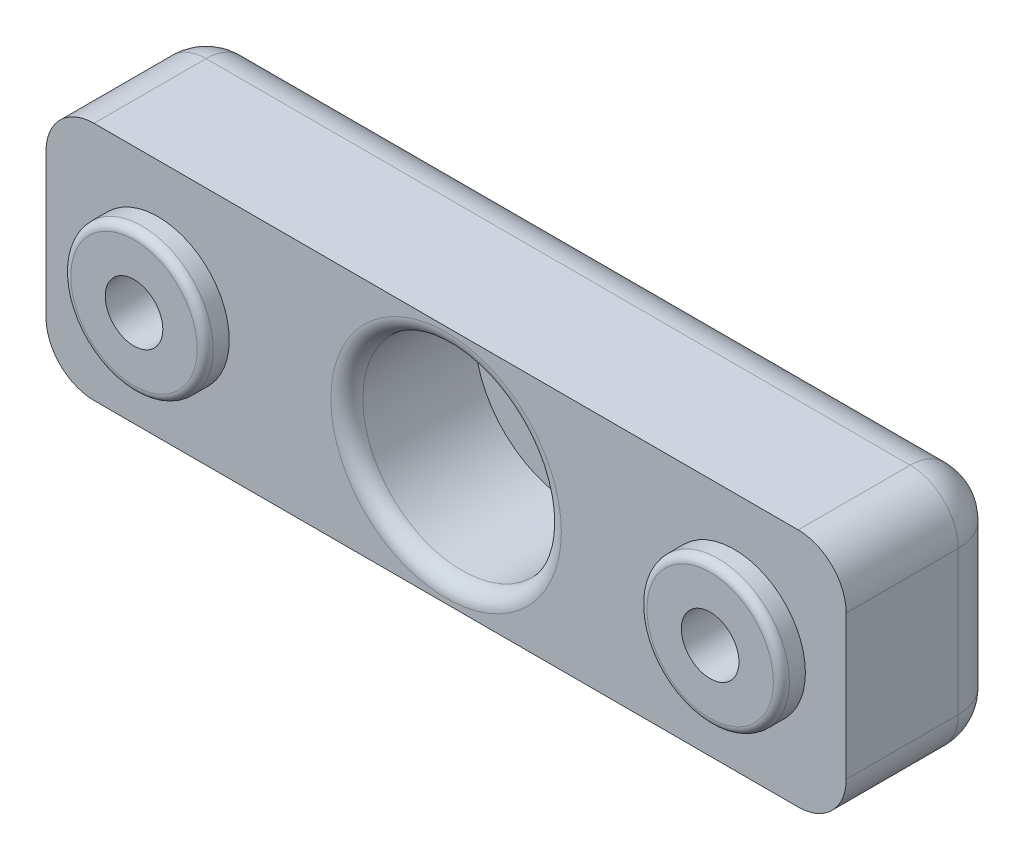
ISO-10303-21;
HEADER;
FILE_DESCRIPTION(('STEP AP214'),'2;1');
FILE_NAME('part.step','',(''),(''),'','','');
FILE_SCHEMA(('AUTOMOTIVE_DESIGN { 1 0 10303 214 1 1 1 1 }'));
ENDSEC;
DATA;
#1=APPLICATION_CONTEXT('core data for automotive mechanical design processes');
#2=APPLICATION_PROTOCOL_DEFINITION('international standard','automotive_design',2000,#1);
#3=PRODUCT_CONTEXT('',#1,'mechanical');
#4=PRODUCT('Part','Part','',(#3));
#5=PRODUCT_RELATED_PRODUCT_CATEGORY('part','',(#4));
#6=PRODUCT_DEFINITION_FORMATION('','',#4);
#7=PRODUCT_DEFINITION_CONTEXT('part definition',#1,'design');
#8=PRODUCT_DEFINITION('design','',#6,#7);
#9=PRODUCT_DEFINITION_SHAPE('','',#8);
#10=(LENGTH_UNIT() NAMED_UNIT(*) SI_UNIT(.MILLI.,.METRE.));
#11=(NAMED_UNIT(*) PLANE_ANGLE_UNIT() SI_UNIT($,.RADIAN.));
#12=(NAMED_UNIT(*) SI_UNIT($,.STERADIAN.) SOLID_ANGLE_UNIT());
#13=UNCERTAINTY_MEASURE_WITH_UNIT(LENGTH_MEASURE(1.E-05),#10,'distance_accuracy_value','');
#14=(GEOMETRIC_REPRESENTATION_CONTEXT(3) GLOBAL_UNCERTAINTY_ASSIGNED_CONTEXT((#13)) GLOBAL_UNIT_ASSIGNED_CONTEXT((#10,
#11,#12)) REPRESENTATION_CONTEXT('',''));
#15=CARTESIAN_POINT('',(0.,0.,0.));
#16=DIRECTION('',(0.,0.,1.));
#17=DIRECTION('',(1.,0.,0.));
#18=AXIS2_PLACEMENT_3D('',#15,#16,#17);
#19=CARTESIAN_POINT('',(-20.4300132750273,8.59792284866469,-4.));
#20=DIRECTION('',(0.,0.,1.));
#21=DIRECTION('',(1.,0.,0.));
#22=AXIS2_PLACEMENT_3D('',#19,#20,#21);
#23=CYLINDRICAL_SURFACE('',#22,1.8);
#24=CARTESIAN_POINT('',(-20.4300132750273,8.59792284866469,11.5));
#25=DIRECTION('',(0.,0.,1.));
#26=DIRECTION('',(1.,0.,0.));
#27=AXIS2_PLACEMENT_3D('',#24,#25,#26);
#28=CIRCLE('',#27,1.8);
#29=CARTESIAN_POINT('',(-18.6300132750273,8.59792284866469,11.5));
#30=VERTEX_POINT('',#29);
#31=EDGE_CURVE('E294',#30,#30,#28,.T.);
#32=ORIENTED_EDGE('',*,*,#31,.T.);
#33=EDGE_LOOP('',(#32));
#34=FACE_BOUND('',#33,.T.);
#35=CARTESIAN_POINT('',(-20.4300132750273,8.59792284866469,3.5));
#36=DIRECTION('',(0.,0.,-1.));
#37=DIRECTION('',(-1.,0.,0.));
#38=AXIS2_PLACEMENT_3D('',#35,#36,#37);
#39=CIRCLE('',#38,1.8);
#40=CARTESIAN_POINT('',(-22.2300132750273,8.59792284866469,3.5));
#41=VERTEX_POINT('',#40);
#42=EDGE_CURVE('E234',#41,#41,#39,.F.);
#43=ORIENTED_EDGE('',*,*,#42,.F.);
#44=EDGE_LOOP('',(#43));
#45=FACE_BOUND('',#44,.T.);
#46=ADVANCED_FACE('F32',(#34,#45),#23,.F.);
#47=CARTESIAN_POINT('',(15.5699867249727,8.59792284866469,-4.));
#48=DIRECTION('',(0.,0.,1.));
#49=DIRECTION('',(1.,0.,0.));
#50=AXIS2_PLACEMENT_3D('',#47,#48,#49);
#51=CYLINDRICAL_SURFACE('',#50,1.8);
#52=CARTESIAN_POINT('',(15.5699867249727,8.59792284866469,11.5));
#53=DIRECTION('',(0.,0.,1.));
#54=DIRECTION('',(1.,0.,0.));
#55=AXIS2_PLACEMENT_3D('',#52,#53,#54);
#56=CIRCLE('',#55,1.8);
#57=CARTESIAN_POINT('',(17.3699867249727,8.59792284866469,11.5));
#58=VERTEX_POINT('',#57);
#59=EDGE_CURVE('E291',#58,#58,#56,.T.);
#60=ORIENTED_EDGE('',*,*,#59,.T.);
#61=EDGE_LOOP('',(#60));
#62=FACE_BOUND('',#61,.T.);
#63=CARTESIAN_POINT('',(15.5699867249727,8.59792284866469,3.5));
#64=DIRECTION('',(0.,0.,-1.));
#65=DIRECTION('',(-1.,0.,0.));
#66=AXIS2_PLACEMENT_3D('',#63,#64,#65);
#67=CIRCLE('',#66,1.8);
#68=CARTESIAN_POINT('',(13.7699867249727,8.59792284866469,3.5));
#69=VERTEX_POINT('',#68);
#70=EDGE_CURVE('E280',#69,#69,#67,.F.);
#71=ORIENTED_EDGE('',*,*,#70,.F.);
#72=EDGE_LOOP('',(#71));
#73=FACE_BOUND('',#72,.T.);
#74=ADVANCED_FACE('F422',(#62,#73),#51,.F.);
#75=CARTESIAN_POINT('',(-27.4300132750273,16.0979228486647,10.));
#76=DIRECTION('',(1.,0.,0.));
#77=DIRECTION('',(0.,1.,0.));
#78=AXIS2_PLACEMENT_3D('',#75,#76,#77);
#79=PLANE('',#78);
#80=DIRECTION('',(0.,-1.,0.));
#81=VECTOR('',#80,1.);
#82=CARTESIAN_POINT('',(-27.4300132750273,16.0979228486647,3.));
#83=LINE('',#82,#81);
#84=CARTESIAN_POINT('',(-27.4300132750273,13.0979228486647,3.));
#85=VERTEX_POINT('',#84);
#86=CARTESIAN_POINT('',(-27.4300132750273,4.09792284866469,3.));
#87=VERTEX_POINT('',#86);
#88=EDGE_CURVE('E47',#85,#87,#83,.T.);
#89=ORIENTED_EDGE('',*,*,#88,.T.);
#90=DIRECTION('',(0.,0.,-1.));
#91=VECTOR('',#90,1.);
#92=CARTESIAN_POINT('',(-27.4300132750273,4.09792284866469,10.));
#93=LINE('',#92,#91);
#94=CARTESIAN_POINT('',(-27.4300132750273,4.09792284866469,10.));
#95=VERTEX_POINT('',#94);
#96=EDGE_CURVE('E360',#87,#95,#93,.F.);
#97=ORIENTED_EDGE('',*,*,#96,.T.);
#98=DIRECTION('',(0.,-1.,0.));
#99=VECTOR('',#98,1.);
#100=CARTESIAN_POINT('',(-27.4300132750273,16.0979228486647,10.));
#101=LINE('',#100,#99);
#102=CARTESIAN_POINT('',(-27.4300132750273,13.0979228486647,10.));
#103=VERTEX_POINT('',#102);
#104=EDGE_CURVE('E306',#103,#95,#101,.T.);
#105=ORIENTED_EDGE('',*,*,#104,.F.);
#106=DIRECTION('',(0.,0.,-1.));
#107=VECTOR('',#106,1.);
#108=CARTESIAN_POINT('',(-27.4300132750273,13.0979228486647,10.));
#109=LINE('',#108,#107);
#110=EDGE_CURVE('E52',#103,#85,#109,.T.);
#111=ORIENTED_EDGE('',*,*,#110,.T.);
#112=EDGE_LOOP('',(#89,#97,#105,#111));
#113=FACE_BOUND('',#112,.T.);
#114=ADVANCED_FACE('F428',(#113),#79,.F.);
#115=CARTESIAN_POINT('',(-27.4300132750273,1.09792284866469,10.));
#116=DIRECTION('',(0.,1.,0.));
#117=DIRECTION('',(0.,0.,1.));
#118=AXIS2_PLACEMENT_3D('',#115,#116,#117);
#119=PLANE('',#118);
#120=DIRECTION('',(1.,0.,0.));
#121=VECTOR('',#120,1.);
#122=CARTESIAN_POINT('',(-27.4300132750273,1.09792284866469,3.));
#123=LINE('',#122,#121);
#124=CARTESIAN_POINT('',(-24.4300132750273,1.09792284866469,3.));
#125=VERTEX_POINT('',#124);
#126=CARTESIAN_POINT('',(19.5699867249727,1.09792284866469,3.));
#127=VERTEX_POINT('',#126);
#128=EDGE_CURVE('E324',#125,#127,#123,.T.);
#129=ORIENTED_EDGE('',*,*,#128,.T.);
#130=DIRECTION('',(0.,0.,-1.));
#131=VECTOR('',#130,1.);
#132=CARTESIAN_POINT('',(19.5699867249727,1.09792284866469,10.));
#133=LINE('',#132,#131);
#134=CARTESIAN_POINT('',(19.5699867249727,1.09792284866469,10.));
#135=VERTEX_POINT('',#134);
#136=EDGE_CURVE('E327',#127,#135,#133,.F.);
#137=ORIENTED_EDGE('',*,*,#136,.T.);
#138=DIRECTION('',(1.,0.,0.));
#139=VECTOR('',#138,1.);
#140=CARTESIAN_POINT('',(-27.4300132750273,1.09792284866469,10.));
#141=LINE('',#140,#139);
#142=CARTESIAN_POINT('',(-24.4300132750273,1.09792284866469,10.));
#143=VERTEX_POINT('',#142);
#144=EDGE_CURVE('E309',#143,#135,#141,.T.);
#145=ORIENTED_EDGE('',*,*,#144,.F.);
#146=DIRECTION('',(0.,0.,-1.));
#147=VECTOR('',#146,1.);
#148=CARTESIAN_POINT('',(-24.4300132750273,1.09792284866469,10.));
#149=LINE('',#148,#147);
#150=EDGE_CURVE('E318',#143,#125,#149,.T.);
#151=ORIENTED_EDGE('',*,*,#150,.T.);
#152=EDGE_LOOP('',(#129,#137,#145,#151));
#153=FACE_BOUND('',#152,.T.);
#154=ADVANCED_FACE('F472',(#153),#119,.F.);
#155=CARTESIAN_POINT('',(22.5699867249727,16.0979228486647,10.));
#156=DIRECTION('',(-1.,0.,0.));
#157=DIRECTION('',(0.,-1.,0.));
#158=AXIS2_PLACEMENT_3D('',#155,#156,#157);
#159=PLANE('',#158);
#160=DIRECTION('',(0.,1.,0.));
#161=VECTOR('',#160,1.);
#162=CARTESIAN_POINT('',(22.5699867249727,16.0979228486647,10.));
#163=LINE('',#162,#161);
#164=CARTESIAN_POINT('',(22.5699867249727,4.09792284866469,10.));
#165=VERTEX_POINT('',#164);
#166=CARTESIAN_POINT('',(22.5699867249727,13.0979228486647,10.));
#167=VERTEX_POINT('',#166);
#168=EDGE_CURVE('E312',#165,#167,#163,.T.);
#169=ORIENTED_EDGE('',*,*,#168,.F.);
#170=DIRECTION('',(0.,0.,-1.));
#171=VECTOR('',#170,1.);
#172=CARTESIAN_POINT('',(22.5699867249727,4.09792284866469,10.));
#173=LINE('',#172,#171);
#174=CARTESIAN_POINT('',(22.5699867249727,4.09792284866469,3.));
#175=VERTEX_POINT('',#174);
#176=EDGE_CURVE('E342',#165,#175,#173,.T.);
#177=ORIENTED_EDGE('',*,*,#176,.T.);
#178=DIRECTION('',(0.,1.,0.));
#179=VECTOR('',#178,1.);
#180=CARTESIAN_POINT('',(22.5699867249727,16.0979228486647,3.));
#181=LINE('',#180,#179);
#182=CARTESIAN_POINT('',(22.5699867249727,13.0979228486647,3.));
#183=VERTEX_POINT('',#182);
#184=EDGE_CURVE('E338',#175,#183,#181,.T.);
#185=ORIENTED_EDGE('',*,*,#184,.T.);
#186=DIRECTION('',(0.,0.,-1.));
#187=VECTOR('',#186,1.);
#188=CARTESIAN_POINT('',(22.5699867249727,13.0979228486647,10.));
#189=LINE('',#188,#187);
#190=EDGE_CURVE('E340',#183,#167,#189,.F.);
#191=ORIENTED_EDGE('',*,*,#190,.T.);
#192=EDGE_LOOP('',(#169,#177,#185,#191));
#193=FACE_BOUND('',#192,.T.);
#194=ADVANCED_FACE('F468',(#193),#159,.F.);
#195=CARTESIAN_POINT('',(-27.4300132750273,16.0979228486647,10.));
#196=DIRECTION('',(0.,-1.,0.));
#197=DIRECTION('',(0.,0.,-1.));
#198=AXIS2_PLACEMENT_3D('',#195,#196,#197);
#199=PLANE('',#198);
#200=DIRECTION('',(-1.,0.,0.));
#201=VECTOR('',#200,1.);
#202=CARTESIAN_POINT('',(-27.4300132750273,16.0979228486647,10.));
#203=LINE('',#202,#201);
#204=CARTESIAN_POINT('',(19.5699867249727,16.0979228486647,10.));
#205=VERTEX_POINT('',#204);
#206=CARTESIAN_POINT('',(-24.4300132750273,16.0979228486647,10.));
#207=VERTEX_POINT('',#206);
#208=EDGE_CURVE('E315',#205,#207,#203,.T.);
#209=ORIENTED_EDGE('',*,*,#208,.F.);
#210=DIRECTION('',(0.,0.,-1.));
#211=VECTOR('',#210,1.);
#212=CARTESIAN_POINT('',(19.5699867249727,16.0979228486647,10.));
#213=LINE('',#212,#211);
#214=CARTESIAN_POINT('',(19.5699867249727,16.0979228486647,3.));
#215=VERTEX_POINT('',#214);
#216=EDGE_CURVE('E356',#205,#215,#213,.T.);
#217=ORIENTED_EDGE('',*,*,#216,.T.);
#218=DIRECTION('',(-1.,0.,0.));
#219=VECTOR('',#218,1.);
#220=CARTESIAN_POINT('',(-27.4300132750273,16.0979228486647,3.));
#221=LINE('',#220,#219);
#222=CARTESIAN_POINT('',(-24.4300132750273,16.0979228486647,3.));
#223=VERTEX_POINT('',#222);
#224=EDGE_CURVE('E352',#215,#223,#221,.T.);
#225=ORIENTED_EDGE('',*,*,#224,.T.);
#226=DIRECTION('',(0.,0.,-1.));
#227=VECTOR('',#226,1.);
#228=CARTESIAN_POINT('',(-24.4300132750273,16.0979228486647,10.));
#229=LINE('',#228,#227);
#230=EDGE_CURVE('E354',#223,#207,#229,.F.);
#231=ORIENTED_EDGE('',*,*,#230,.T.);
#232=EDGE_LOOP('',(#209,#217,#225,#231));
#233=FACE_BOUND('',#232,.T.);
#234=ADVANCED_FACE('F461',(#233),#199,.F.);
#235=CARTESIAN_POINT('',(0.,0.,10.));
#236=DIRECTION('',(0.,0.,1.));
#237=DIRECTION('',(1.,0.,0.));
#238=AXIS2_PLACEMENT_3D('',#235,#236,#237);
#239=PLANE('',#238);
#240=CARTESIAN_POINT('',(-2.43001327502733,8.59792284866469,10.));
#241=DIRECTION('',(0.,0.,1.));
#242=DIRECTION('',(1.,0.,0.));
#243=AXIS2_PLACEMENT_3D('',#240,#241,#242);
#244=CIRCLE('',#243,7.2);
#245=CARTESIAN_POINT('',(4.76998672497267,8.59792284866469,10.));
#246=VERTEX_POINT('',#245);
#247=EDGE_CURVE('E398',#246,#246,#244,.F.);
#248=ORIENTED_EDGE('',*,*,#247,.T.);
#249=EDGE_LOOP('',(#248));
#250=FACE_BOUND('',#249,.T.);
#251=CARTESIAN_POINT('',(15.5699867249727,8.59792284866469,10.));
#252=DIRECTION('',(0.,0.,1.));
#253=DIRECTION('',(1.,0.,0.));
#254=AXIS2_PLACEMENT_3D('',#251,#252,#253);
#255=CIRCLE('',#254,4.45);
#256=CARTESIAN_POINT('',(20.0199867249727,8.59792284866469,10.));
#257=VERTEX_POINT('',#256);
#258=EDGE_CURVE('E300',#257,#257,#255,.T.);
#259=ORIENTED_EDGE('',*,*,#258,.F.);
#260=EDGE_LOOP('',(#259));
#261=FACE_BOUND('',#260,.T.);
#262=CARTESIAN_POINT('',(-20.4300132750273,8.59792284866469,10.));
#263=DIRECTION('',(0.,0.,1.));
#264=DIRECTION('',(1.,0.,0.));
#265=AXIS2_PLACEMENT_3D('',#262,#263,#264);
#266=CIRCLE('',#265,4.45);
#267=CARTESIAN_POINT('',(-15.9800132750273,8.59792284866469,10.));
#268=VERTEX_POINT('',#267);
#269=EDGE_CURVE('E303',#268,#268,#266,.T.);
#270=ORIENTED_EDGE('',*,*,#269,.F.);
#271=EDGE_LOOP('',(#270));
#272=FACE_BOUND('',#271,.T.);
#273=ORIENTED_EDGE('',*,*,#144,.T.);
#274=CARTESIAN_POINT('',(19.5699867249727,4.09792284866469,10.));
#275=DIRECTION('',(0.,0.,1.));
#276=DIRECTION('',(1.,0.,0.));
#277=AXIS2_PLACEMENT_3D('',#274,#275,#276);
#278=CIRCLE('',#277,3.);
#279=EDGE_CURVE('E350',#135,#165,#278,.T.);
#280=ORIENTED_EDGE('',*,*,#279,.T.);
#281=ORIENTED_EDGE('',*,*,#168,.T.);
#282=CARTESIAN_POINT('',(19.5699867249727,13.0979228486647,10.));
#283=DIRECTION('',(0.,0.,1.));
#284=DIRECTION('',(1.,0.,0.));
#285=AXIS2_PLACEMENT_3D('',#282,#283,#284);
#286=CIRCLE('',#285,3.);
#287=EDGE_CURVE('E348',#167,#205,#286,.T.);
#288=ORIENTED_EDGE('',*,*,#287,.T.);
#289=ORIENTED_EDGE('',*,*,#208,.T.);
#290=CARTESIAN_POINT('',(-24.4300132750273,13.0979228486647,10.));
#291=DIRECTION('',(0.,0.,1.));
#292=DIRECTION('',(1.,0.,0.));
#293=AXIS2_PLACEMENT_3D('',#290,#291,#292);
#294=CIRCLE('',#293,3.);
#295=EDGE_CURVE('E344',#207,#103,#294,.T.);
#296=ORIENTED_EDGE('',*,*,#295,.T.);
#297=ORIENTED_EDGE('',*,*,#104,.T.);
#298=CARTESIAN_POINT('',(-24.4300132750273,4.09792284866469,10.));
#299=DIRECTION('',(0.,0.,1.));
#300=DIRECTION('',(1.,0.,0.));
#301=AXIS2_PLACEMENT_3D('',#298,#299,#300);
#302=CIRCLE('',#301,3.);
#303=EDGE_CURVE('E346',#95,#143,#302,.T.);
#304=ORIENTED_EDGE('',*,*,#303,.T.);
#305=EDGE_LOOP('',(#273,#280,#281,#288,#289,#296,#297,#304));
#306=FACE_BOUND('',#305,.T.);
#307=ADVANCED_FACE('F458',(#250,#261,#272,#306),#239,.T.);
#308=CARTESIAN_POINT('',(0.,0.,0.));
#309=DIRECTION('',(0.,0.,1.));
#310=DIRECTION('',(1.,0.,0.));
#311=AXIS2_PLACEMENT_3D('',#308,#309,#310);
#312=PLANE('',#311);
#313=DIRECTION('',(0.,1.,0.));
#314=VECTOR('',#313,1.);
#315=CARTESIAN_POINT('',(19.5699867249727,0.,0.));
#316=LINE('',#315,#314);
#317=CARTESIAN_POINT('',(19.5699867249727,13.0979228486647,0.));
#318=VERTEX_POINT('',#317);
#319=CARTESIAN_POINT('',(19.5699867249727,4.09792284866469,0.));
#320=VERTEX_POINT('',#319);
#321=EDGE_CURVE('E333',#318,#320,#316,.F.);
#322=ORIENTED_EDGE('',*,*,#321,.T.);
#323=DIRECTION('',(1.,0.,0.));
#324=VECTOR('',#323,1.);
#325=CARTESIAN_POINT('',(0.,4.09792284866469,0.));
#326=LINE('',#325,#324);
#327=CARTESIAN_POINT('',(-24.4300132750273,4.09792284866469,0.));
#328=VERTEX_POINT('',#327);
#329=EDGE_CURVE('E335',#320,#328,#326,.F.);
#330=ORIENTED_EDGE('',*,*,#329,.T.);
#331=DIRECTION('',(0.,-1.,0.));
#332=VECTOR('',#331,1.);
#333=CARTESIAN_POINT('',(-24.4300132750273,0.,0.));
#334=LINE('',#333,#332);
#335=CARTESIAN_POINT('',(-24.4300132750273,13.0979228486647,0.));
#336=VERTEX_POINT('',#335);
#337=EDGE_CURVE('E331',#328,#336,#334,.F.);
#338=ORIENTED_EDGE('',*,*,#337,.T.);
#339=DIRECTION('',(-1.,0.,0.));
#340=VECTOR('',#339,1.);
#341=CARTESIAN_POINT('',(0.,13.0979228486647,0.));
#342=LINE('',#341,#340);
#343=EDGE_CURVE('E329',#336,#318,#342,.F.);
#344=ORIENTED_EDGE('',*,*,#343,.T.);
#345=EDGE_LOOP('',(#322,#330,#338,#344));
#346=FACE_BOUND('',#345,.T.);
#347=DIRECTION('',(0.5,0.866025403784439,0.));
#348=VECTOR('',#347,1.);
#349=CARTESIAN_POINT('',(-23.951849917084,8.59792284866469,0.));
#350=LINE('',#349,#348);
#351=CARTESIAN_POINT('',(-23.951849917084,8.59792284866469,0.));
#352=VERTEX_POINT('',#351);
#353=CARTESIAN_POINT('',(-22.1909315960557,11.6479228486647,0.));
#354=VERTEX_POINT('',#353);
#355=EDGE_CURVE('E221',#352,#354,#350,.T.);
#356=ORIENTED_EDGE('',*,*,#355,.F.);
#357=DIRECTION('',(-0.5,0.866025403784439,0.));
#358=VECTOR('',#357,1.);
#359=CARTESIAN_POINT('',(-22.1909315960557,5.54792284866469,0.));
#360=LINE('',#359,#358);
#361=CARTESIAN_POINT('',(-22.1909315960557,5.54792284866469,0.));
#362=VERTEX_POINT('',#361);
#363=EDGE_CURVE('E188',#362,#352,#360,.T.);
#364=ORIENTED_EDGE('',*,*,#363,.F.);
#365=DIRECTION('',(-1.,0.,0.));
#366=VECTOR('',#365,1.);
#367=CARTESIAN_POINT('',(-18.669094953999,5.54792284866469,0.));
#368=LINE('',#367,#366);
#369=CARTESIAN_POINT('',(-18.669094953999,5.54792284866469,0.));
#370=VERTEX_POINT('',#369);
#371=EDGE_CURVE('E207',#370,#362,#368,.T.);
#372=ORIENTED_EDGE('',*,*,#371,.F.);
#373=DIRECTION('',(-0.500000000000001,-0.866025403784438,0.));
#374=VECTOR('',#373,1.);
#375=CARTESIAN_POINT('',(-16.9081766329706,8.59792284866469,0.));
#376=LINE('',#375,#374);
#377=CARTESIAN_POINT('',(-16.9081766329706,8.59792284866469,0.));
#378=VERTEX_POINT('',#377);
#379=EDGE_CURVE('E210',#378,#370,#376,.T.);
#380=ORIENTED_EDGE('',*,*,#379,.F.);
#381=DIRECTION('',(0.500000000000001,-0.866025403784438,0.));
#382=VECTOR('',#381,1.);
#383=CARTESIAN_POINT('',(-18.669094953999,11.6479228486647,0.));
#384=LINE('',#383,#382);
#385=CARTESIAN_POINT('',(-18.669094953999,11.6479228486647,0.));
#386=VERTEX_POINT('',#385);
#387=EDGE_CURVE('E227',#386,#378,#384,.T.);
#388=ORIENTED_EDGE('',*,*,#387,.F.);
#389=DIRECTION('',(1.,0.,0.));
#390=VECTOR('',#389,1.);
#391=CARTESIAN_POINT('',(-22.1909315960557,11.6479228486647,0.));
#392=LINE('',#391,#390);
#393=EDGE_CURVE('E224',#354,#386,#392,.T.);
#394=ORIENTED_EDGE('',*,*,#393,.F.);
#395=EDGE_LOOP('',(#356,#364,#372,#380,#388,#394));
#396=FACE_BOUND('',#395,.T.);
#397=DIRECTION('',(0.5,0.866025403784439,0.));
#398=VECTOR('',#397,1.);
#399=CARTESIAN_POINT('',(12.048150082916,8.59792284866469,0.));
#400=LINE('',#399,#398);
#401=CARTESIAN_POINT('',(12.048150082916,8.59792284866469,0.));
#402=VERTEX_POINT('',#401);
#403=CARTESIAN_POINT('',(13.8090684039443,11.6479228486647,0.));
#404=VERTEX_POINT('',#403);
#405=EDGE_CURVE('E264',#402,#404,#400,.T.);
#406=ORIENTED_EDGE('',*,*,#405,.F.);
#407=DIRECTION('',(-0.5,0.866025403784439,0.));
#408=VECTOR('',#407,1.);
#409=CARTESIAN_POINT('',(13.8090684039443,5.54792284866469,0.));
#410=LINE('',#409,#408);
#411=CARTESIAN_POINT('',(13.8090684039443,5.54792284866469,0.));
#412=VERTEX_POINT('',#411);
#413=EDGE_CURVE('E262',#412,#402,#410,.T.);
#414=ORIENTED_EDGE('',*,*,#413,.F.);
#415=DIRECTION('',(-1.,0.,0.));
#416=VECTOR('',#415,1.);
#417=CARTESIAN_POINT('',(17.330905046001,5.54792284866469,0.));
#418=LINE('',#417,#416);
#419=CARTESIAN_POINT('',(17.330905046001,5.54792284866469,0.));
#420=VERTEX_POINT('',#419);
#421=EDGE_CURVE('E246',#420,#412,#418,.T.);
#422=ORIENTED_EDGE('',*,*,#421,.F.);
#423=DIRECTION('',(-0.5,-0.866025403784439,0.));
#424=VECTOR('',#423,1.);
#425=CARTESIAN_POINT('',(19.0918233670294,8.59792284866469,0.));
#426=LINE('',#425,#424);
#427=CARTESIAN_POINT('',(19.0918233670294,8.59792284866469,0.));
#428=VERTEX_POINT('',#427);
#429=EDGE_CURVE('E273',#428,#420,#426,.T.);
#430=ORIENTED_EDGE('',*,*,#429,.F.);
#431=DIRECTION('',(0.5,-0.866025403784439,0.));
#432=VECTOR('',#431,1.);
#433=CARTESIAN_POINT('',(17.330905046001,11.6479228486647,0.));
#434=LINE('',#433,#432);
#435=CARTESIAN_POINT('',(17.330905046001,11.6479228486647,0.));
#436=VERTEX_POINT('',#435);
#437=EDGE_CURVE('E270',#436,#428,#434,.T.);
#438=ORIENTED_EDGE('',*,*,#437,.F.);
#439=DIRECTION('',(1.,0.,0.));
#440=VECTOR('',#439,1.);
#441=CARTESIAN_POINT('',(13.8090684039443,11.6479228486647,0.));
#442=LINE('',#441,#440);
#443=EDGE_CURVE('E267',#404,#436,#442,.T.);
#444=ORIENTED_EDGE('',*,*,#443,.F.);
#445=EDGE_LOOP('',(#406,#414,#422,#430,#438,#444));
#446=FACE_BOUND('',#445,.T.);
#447=ADVANCED_FACE('F456',(#346,#396,#446),#312,.F.);
#448=CARTESIAN_POINT('',(-20.4300132750273,8.59792284866469,11.5));
#449=DIRECTION('',(0.,0.,-1.));
#450=DIRECTION('',(-1.,0.,0.));
#451=AXIS2_PLACEMENT_3D('',#448,#449,#450);
#452=CYLINDRICAL_SURFACE('',#451,4.45);
#453=CARTESIAN_POINT('',(-20.4300132750273,8.59792284866469,11.));
#454=DIRECTION('',(0.,0.,1.));
#455=DIRECTION('',(1.,0.,0.));
#456=AXIS2_PLACEMENT_3D('',#453,#454,#455);
#457=CIRCLE('',#456,4.45);
#458=CARTESIAN_POINT('',(-15.9800132750273,8.59792284866469,11.));
#459=VERTEX_POINT('',#458);
#460=EDGE_CURVE('E11',#459,#459,#457,.F.);
#461=ORIENTED_EDGE('',*,*,#460,.T.);
#462=EDGE_LOOP('',(#461));
#463=FACE_BOUND('',#462,.T.);
#464=ORIENTED_EDGE('',*,*,#269,.T.);
#465=EDGE_LOOP('',(#464));
#466=FACE_BOUND('',#465,.T.);
#467=ADVANCED_FACE('F453',(#463,#466),#452,.T.);
#468=CARTESIAN_POINT('',(-20.4300132750273,8.59792284866469,11.5));
#469=DIRECTION('',(0.,0.,1.));
#470=DIRECTION('',(1.,0.,0.));
#471=AXIS2_PLACEMENT_3D('',#468,#469,#470);
#472=PLANE('',#471);
#473=CARTESIAN_POINT('',(-20.4300132750273,8.59792284866469,11.5));
#474=DIRECTION('',(0.,0.,1.));
#475=DIRECTION('',(1.,0.,0.));
#476=AXIS2_PLACEMENT_3D('',#473,#474,#475);
#477=CIRCLE('',#476,3.95);
#478=CARTESIAN_POINT('',(-16.4800132750273,8.59792284866469,11.5));
#479=VERTEX_POINT('',#478);
#480=EDGE_CURVE('E40',#479,#479,#477,.T.);
#481=ORIENTED_EDGE('',*,*,#480,.T.);
#482=EDGE_LOOP('',(#481));
#483=FACE_BOUND('',#482,.T.);
#484=ORIENTED_EDGE('',*,*,#31,.F.);
#485=EDGE_LOOP('',(#484));
#486=FACE_BOUND('',#485,.T.);
#487=ADVANCED_FACE('F409',(#483,#486),#472,.T.);
#488=CARTESIAN_POINT('',(15.5699867249727,8.59792284866469,11.5));
#489=DIRECTION('',(0.,0.,-1.));
#490=DIRECTION('',(-1.,0.,0.));
#491=AXIS2_PLACEMENT_3D('',#488,#489,#490);
#492=CYLINDRICAL_SURFACE('',#491,4.45);
#493=CARTESIAN_POINT('',(15.5699867249727,8.59792284866469,11.));
#494=DIRECTION('',(0.,0.,1.));
#495=DIRECTION('',(1.,0.,0.));
#496=AXIS2_PLACEMENT_3D('',#493,#494,#495);
#497=CIRCLE('',#496,4.45);
#498=CARTESIAN_POINT('',(20.0199867249727,8.59792284866469,11.));
#499=VERTEX_POINT('',#498);
#500=EDGE_CURVE('E404',#499,#499,#497,.F.);
#501=ORIENTED_EDGE('',*,*,#500,.T.);
#502=EDGE_LOOP('',(#501));
#503=FACE_BOUND('',#502,.T.);
#504=ORIENTED_EDGE('',*,*,#258,.T.);
#505=EDGE_LOOP('',(#504));
#506=FACE_BOUND('',#505,.T.);
#507=ADVANCED_FACE('F446',(#503,#506),#492,.T.);
#508=CARTESIAN_POINT('',(15.5699867249727,8.59792284866469,11.5));
#509=DIRECTION('',(0.,0.,1.));
#510=DIRECTION('',(1.,0.,0.));
#511=AXIS2_PLACEMENT_3D('',#508,#509,#510);
#512=PLANE('',#511);
#513=CARTESIAN_POINT('',(15.5699867249727,8.59792284866469,11.5));
#514=DIRECTION('',(0.,0.,1.));
#515=DIRECTION('',(1.,0.,0.));
#516=AXIS2_PLACEMENT_3D('',#513,#514,#515);
#517=CIRCLE('',#516,3.95);
#518=CARTESIAN_POINT('',(19.5199867249727,8.59792284866469,11.5));
#519=VERTEX_POINT('',#518);
#520=EDGE_CURVE('E401',#519,#519,#517,.T.);
#521=ORIENTED_EDGE('',*,*,#520,.T.);
#522=EDGE_LOOP('',(#521));
#523=FACE_BOUND('',#522,.T.);
#524=ORIENTED_EDGE('',*,*,#59,.F.);
#525=EDGE_LOOP('',(#524));
#526=FACE_BOUND('',#525,.T.);
#527=ADVANCED_FACE('F442',(#523,#526),#512,.T.);
#528=CARTESIAN_POINT('',(-2.43001327502733,8.59792284866469,2.));
#529=DIRECTION('',(0.,0.,1.));
#530=DIRECTION('',(1.,0.,0.));
#531=AXIS2_PLACEMENT_3D('',#528,#529,#530);
#532=CYLINDRICAL_SURFACE('',#531,6.2);
#533=CARTESIAN_POINT('',(-2.43001327502733,8.59792284866469,9.));
#534=DIRECTION('',(0.,0.,1.));
#535=DIRECTION('',(1.,0.,0.));
#536=AXIS2_PLACEMENT_3D('',#533,#534,#535);
#537=CIRCLE('',#536,6.2);
#538=CARTESIAN_POINT('',(3.76998672497267,8.59792284866469,9.));
#539=VERTEX_POINT('',#538);
#540=EDGE_CURVE('E362',#539,#539,#537,.T.);
#541=ORIENTED_EDGE('',*,*,#540,.T.);
#542=EDGE_LOOP('',(#541));
#543=FACE_BOUND('',#542,.T.);
#544=CARTESIAN_POINT('',(-2.43001327502733,8.59792284866469,2.));
#545=DIRECTION('',(0.,0.,1.));
#546=DIRECTION('',(1.,0.,0.));
#547=AXIS2_PLACEMENT_3D('',#544,#545,#546);
#548=CIRCLE('',#547,6.2);
#549=CARTESIAN_POINT('',(3.76998672497267,8.59792284866469,2.));
#550=VERTEX_POINT('',#549);
#551=EDGE_CURVE('E297',#550,#550,#548,.T.);
#552=ORIENTED_EDGE('',*,*,#551,.F.);
#553=EDGE_LOOP('',(#552));
#554=FACE_BOUND('',#553,.T.);
#555=ADVANCED_FACE('F438',(#543,#554),#532,.F.);
#556=CARTESIAN_POINT('',(-2.43001327502733,8.59792284866469,2.));
#557=DIRECTION('',(0.,0.,1.));
#558=DIRECTION('',(1.,0.,0.));
#559=AXIS2_PLACEMENT_3D('',#556,#557,#558);
#560=PLANE('',#559);
#561=ORIENTED_EDGE('',*,*,#551,.T.);
#562=EDGE_LOOP('',(#561));
#563=FACE_BOUND('',#562,.T.);
#564=ADVANCED_FACE('F434',(#563),#560,.T.);
#565=CARTESIAN_POINT('',(0.,0.,3.5));
#566=DIRECTION('',(0.,0.,-1.));
#567=DIRECTION('',(-1.,0.,0.));
#568=AXIS2_PLACEMENT_3D('',#565,#566,#567);
#569=PLANE('',#568);
#570=DIRECTION('',(-0.5,0.866025403784439,0.));
#571=VECTOR('',#570,1.);
#572=CARTESIAN_POINT('',(13.8090684039443,5.54792284866469,3.5));
#573=LINE('',#572,#571);
#574=CARTESIAN_POINT('',(13.8090684039443,5.54792284866469,3.5));
#575=VERTEX_POINT('',#574);
#576=CARTESIAN_POINT('',(12.048150082916,8.59792284866469,3.5));
#577=VERTEX_POINT('',#576);
#578=EDGE_CURVE('E242',#575,#577,#573,.T.);
#579=ORIENTED_EDGE('',*,*,#578,.T.);
#580=DIRECTION('',(0.5,0.866025403784439,0.));
#581=VECTOR('',#580,1.);
#582=CARTESIAN_POINT('',(12.048150082916,8.59792284866469,3.5));
#583=LINE('',#582,#581);
#584=CARTESIAN_POINT('',(13.8090684039443,11.6479228486647,3.5));
#585=VERTEX_POINT('',#584);
#586=EDGE_CURVE('E245',#577,#585,#583,.T.);
#587=ORIENTED_EDGE('',*,*,#586,.T.);
#588=DIRECTION('',(1.,0.,0.));
#589=VECTOR('',#588,1.);
#590=CARTESIAN_POINT('',(13.8090684039443,11.6479228486647,3.5));
#591=LINE('',#590,#589);
#592=CARTESIAN_POINT('',(17.330905046001,11.6479228486647,3.5));
#593=VERTEX_POINT('',#592);
#594=EDGE_CURVE('E249',#585,#593,#591,.T.);
#595=ORIENTED_EDGE('',*,*,#594,.T.);
#596=DIRECTION('',(0.5,-0.866025403784439,0.));
#597=VECTOR('',#596,1.);
#598=CARTESIAN_POINT('',(17.330905046001,11.6479228486647,3.5));
#599=LINE('',#598,#597);
#600=CARTESIAN_POINT('',(19.0918233670294,8.59792284866469,3.5));
#601=VERTEX_POINT('',#600);
#602=EDGE_CURVE('E252',#593,#601,#599,.T.);
#603=ORIENTED_EDGE('',*,*,#602,.T.);
#604=DIRECTION('',(-0.5,-0.866025403784439,0.));
#605=VECTOR('',#604,1.);
#606=CARTESIAN_POINT('',(19.0918233670294,8.59792284866469,3.5));
#607=LINE('',#606,#605);
#608=CARTESIAN_POINT('',(17.330905046001,5.54792284866469,3.5));
#609=VERTEX_POINT('',#608);
#610=EDGE_CURVE('E255',#601,#609,#607,.T.);
#611=ORIENTED_EDGE('',*,*,#610,.T.);
#612=DIRECTION('',(-1.,0.,0.));
#613=VECTOR('',#612,1.);
#614=CARTESIAN_POINT('',(17.330905046001,5.54792284866469,3.5));
#615=LINE('',#614,#613);
#616=EDGE_CURVE('E258',#609,#575,#615,.T.);
#617=ORIENTED_EDGE('',*,*,#616,.T.);
#618=EDGE_LOOP('',(#579,#587,#595,#603,#611,#617));
#619=FACE_BOUND('',#618,.T.);
#620=ORIENTED_EDGE('',*,*,#70,.T.);
#621=EDGE_LOOP('',(#620));
#622=FACE_BOUND('',#621,.T.);
#623=ADVANCED_FACE('F437',(#619,#622),#569,.T.);
#624=CARTESIAN_POINT('',(13.8090684039443,5.54792284866469,3.5));
#625=DIRECTION('',(-0.866025403784439,-0.5,0.));
#626=DIRECTION('',(0.5,-0.866025403784439,0.));
#627=AXIS2_PLACEMENT_3D('',#624,#625,#626);
#628=PLANE('',#627);
#629=ORIENTED_EDGE('',*,*,#413,.T.);
#630=DIRECTION('',(0.,0.,-1.));
#631=VECTOR('',#630,1.);
#632=CARTESIAN_POINT('',(12.048150082916,8.59792284866469,3.5));
#633=LINE('',#632,#631);
#634=EDGE_CURVE('E261',#577,#402,#633,.T.);
#635=ORIENTED_EDGE('',*,*,#634,.F.);
#636=ORIENTED_EDGE('',*,*,#578,.F.);
#637=DIRECTION('',(0.,0.,-1.));
#638=VECTOR('',#637,1.);
#639=CARTESIAN_POINT('',(13.8090684039443,5.54792284866469,3.5));
#640=LINE('',#639,#638);
#641=EDGE_CURVE('E278',#575,#412,#640,.T.);
#642=ORIENTED_EDGE('',*,*,#641,.T.);
#643=EDGE_LOOP('',(#629,#635,#636,#642));
#644=FACE_BOUND('',#643,.T.);
#645=ADVANCED_FACE('F586',(#644),#628,.F.);
#646=CARTESIAN_POINT('',(17.330905046001,5.54792284866469,3.5));
#647=DIRECTION('',(0.,-1.,0.));
#648=DIRECTION('',(1.,0.,0.));
#649=AXIS2_PLACEMENT_3D('',#646,#647,#648);
#650=PLANE('',#649);
#651=ORIENTED_EDGE('',*,*,#421,.T.);
#652=ORIENTED_EDGE('',*,*,#641,.F.);
#653=ORIENTED_EDGE('',*,*,#616,.F.);
#654=DIRECTION('',(0.,0.,-1.));
#655=VECTOR('',#654,1.);
#656=CARTESIAN_POINT('',(17.330905046001,5.54792284866469,3.5));
#657=LINE('',#656,#655);
#658=EDGE_CURVE('E281',#609,#420,#657,.T.);
#659=ORIENTED_EDGE('',*,*,#658,.T.);
#660=EDGE_LOOP('',(#651,#652,#653,#659));
#661=FACE_BOUND('',#660,.T.);
#662=ADVANCED_FACE('F589',(#661),#650,.F.);
#663=CARTESIAN_POINT('',(19.0918233670294,8.59792284866469,3.5));
#664=DIRECTION('',(0.866025403784439,-0.5,0.));
#665=DIRECTION('',(0.5,0.866025403784439,0.));
#666=AXIS2_PLACEMENT_3D('',#663,#664,#665);
#667=PLANE('',#666);
#668=ORIENTED_EDGE('',*,*,#429,.T.);
#669=ORIENTED_EDGE('',*,*,#658,.F.);
#670=ORIENTED_EDGE('',*,*,#610,.F.);
#671=DIRECTION('',(0.,0.,-1.));
#672=VECTOR('',#671,1.);
#673=CARTESIAN_POINT('',(19.0918233670294,8.59792284866469,3.5));
#674=LINE('',#673,#672);
#675=EDGE_CURVE('E283',#601,#428,#674,.T.);
#676=ORIENTED_EDGE('',*,*,#675,.T.);
#677=EDGE_LOOP('',(#668,#669,#670,#676));
#678=FACE_BOUND('',#677,.T.);
#679=ADVANCED_FACE('F592',(#678),#667,.F.);
#680=CARTESIAN_POINT('',(17.330905046001,11.6479228486647,3.5));
#681=DIRECTION('',(0.866025403784439,0.5,0.));
#682=DIRECTION('',(-0.5,0.866025403784439,0.));
#683=AXIS2_PLACEMENT_3D('',#680,#681,#682);
#684=PLANE('',#683);
#685=ORIENTED_EDGE('',*,*,#437,.T.);
#686=ORIENTED_EDGE('',*,*,#675,.F.);
#687=ORIENTED_EDGE('',*,*,#602,.F.);
#688=DIRECTION('',(0.,0.,-1.));
#689=VECTOR('',#688,1.);
#690=CARTESIAN_POINT('',(17.330905046001,11.6479228486647,3.5));
#691=LINE('',#690,#689);
#692=EDGE_CURVE('E285',#593,#436,#691,.T.);
#693=ORIENTED_EDGE('',*,*,#692,.T.);
#694=EDGE_LOOP('',(#685,#686,#687,#693));
#695=FACE_BOUND('',#694,.T.);
#696=ADVANCED_FACE('F596',(#695),#684,.F.);
#697=CARTESIAN_POINT('',(13.8090684039443,11.6479228486647,3.5));
#698=DIRECTION('',(0.,1.,0.));
#699=DIRECTION('',(0.,0.,1.));
#700=AXIS2_PLACEMENT_3D('',#697,#698,#699);
#701=PLANE('',#700);
#702=ORIENTED_EDGE('',*,*,#443,.T.);
#703=ORIENTED_EDGE('',*,*,#692,.F.);
#704=ORIENTED_EDGE('',*,*,#594,.F.);
#705=DIRECTION('',(0.,0.,-1.));
#706=VECTOR('',#705,1.);
#707=CARTESIAN_POINT('',(13.8090684039443,11.6479228486647,3.5));
#708=LINE('',#707,#706);
#709=EDGE_CURVE('E287',#585,#404,#708,.T.);
#710=ORIENTED_EDGE('',*,*,#709,.T.);
#711=EDGE_LOOP('',(#702,#703,#704,#710));
#712=FACE_BOUND('',#711,.T.);
#713=ADVANCED_FACE('F598',(#712),#701,.F.);
#714=CARTESIAN_POINT('',(12.048150082916,8.59792284866469,3.5));
#715=DIRECTION('',(-0.866025403784439,0.5,0.));
#716=DIRECTION('',(-0.5,-0.866025403784439,0.));
#717=AXIS2_PLACEMENT_3D('',#714,#715,#716);
#718=PLANE('',#717);
#719=ORIENTED_EDGE('',*,*,#405,.T.);
#720=ORIENTED_EDGE('',*,*,#709,.F.);
#721=ORIENTED_EDGE('',*,*,#586,.F.);
#722=ORIENTED_EDGE('',*,*,#634,.T.);
#723=EDGE_LOOP('',(#719,#720,#721,#722));
#724=FACE_BOUND('',#723,.T.);
#725=ADVANCED_FACE('F581',(#724),#718,.F.);
#726=CARTESIAN_POINT('',(0.,0.,3.5));
#727=DIRECTION('',(0.,0.,-1.));
#728=DIRECTION('',(-1.,0.,0.));
#729=AXIS2_PLACEMENT_3D('',#726,#727,#728);
#730=PLANE('',#729);
#731=DIRECTION('',(-0.5,0.866025403784439,0.));
#732=VECTOR('',#731,1.);
#733=CARTESIAN_POINT('',(-22.1909315960557,5.54792284866469,3.5));
#734=LINE('',#733,#732);
#735=CARTESIAN_POINT('',(-22.1909315960557,5.54792284866469,3.5));
#736=VERTEX_POINT('',#735);
#737=CARTESIAN_POINT('',(-23.951849917084,8.59792284866469,3.5));
#738=VERTEX_POINT('',#737);
#739=EDGE_CURVE('E185',#736,#738,#734,.T.);
#740=ORIENTED_EDGE('',*,*,#739,.T.);
#741=DIRECTION('',(0.5,0.866025403784439,0.));
#742=VECTOR('',#741,1.);
#743=CARTESIAN_POINT('',(-23.951849917084,8.59792284866469,3.5));
#744=LINE('',#743,#742);
#745=CARTESIAN_POINT('',(-22.1909315960557,11.6479228486647,3.5));
#746=VERTEX_POINT('',#745);
#747=EDGE_CURVE('E196',#738,#746,#744,.T.);
#748=ORIENTED_EDGE('',*,*,#747,.T.);
#749=DIRECTION('',(1.,0.,0.));
#750=VECTOR('',#749,1.);
#751=CARTESIAN_POINT('',(-22.1909315960557,11.6479228486647,3.5));
#752=LINE('',#751,#750);
#753=CARTESIAN_POINT('',(-18.669094953999,11.6479228486647,3.5));
#754=VERTEX_POINT('',#753);
#755=EDGE_CURVE('E201',#746,#754,#752,.T.);
#756=ORIENTED_EDGE('',*,*,#755,.T.);
#757=DIRECTION('',(0.500000000000001,-0.866025403784438,0.));
#758=VECTOR('',#757,1.);
#759=CARTESIAN_POINT('',(-18.669094953999,11.6479228486647,3.5));
#760=LINE('',#759,#758);
#761=CARTESIAN_POINT('',(-16.9081766329706,8.59792284866469,3.5));
#762=VERTEX_POINT('',#761);
#763=EDGE_CURVE('E214',#754,#762,#760,.T.);
#764=ORIENTED_EDGE('',*,*,#763,.T.);
#765=DIRECTION('',(-0.500000000000001,-0.866025403784438,0.));
#766=VECTOR('',#765,1.);
#767=CARTESIAN_POINT('',(-16.9081766329706,8.59792284866469,3.5));
#768=LINE('',#767,#766);
#769=CARTESIAN_POINT('',(-18.669094953999,5.54792284866469,3.5));
#770=VERTEX_POINT('',#769);
#771=EDGE_CURVE('E217',#762,#770,#768,.T.);
#772=ORIENTED_EDGE('',*,*,#771,.T.);
#773=DIRECTION('',(-1.,0.,0.));
#774=VECTOR('',#773,1.);
#775=CARTESIAN_POINT('',(-18.669094953999,5.54792284866469,3.5));
#776=LINE('',#775,#774);
#777=EDGE_CURVE('E193',#770,#736,#776,.T.);
#778=ORIENTED_EDGE('',*,*,#777,.T.);
#779=EDGE_LOOP('',(#740,#748,#756,#764,#772,#778));
#780=FACE_BOUND('',#779,.T.);
#781=ORIENTED_EDGE('',*,*,#42,.T.);
#782=EDGE_LOOP('',(#781));
#783=FACE_BOUND('',#782,.T.);
#784=ADVANCED_FACE('F203',(#780,#783),#730,.T.);
#785=CARTESIAN_POINT('',(-22.1909315960557,5.54792284866469,3.5));
#786=DIRECTION('',(-0.866025403784439,-0.5,0.));
#787=DIRECTION('',(0.5,-0.866025403784439,0.));
#788=AXIS2_PLACEMENT_3D('',#785,#786,#787);
#789=PLANE('',#788);
#790=ORIENTED_EDGE('',*,*,#363,.T.);
#791=DIRECTION('',(0.,0.,-1.));
#792=VECTOR('',#791,1.);
#793=CARTESIAN_POINT('',(-23.951849917084,8.59792284866469,3.5));
#794=LINE('',#793,#792);
#795=EDGE_CURVE('E181',#738,#352,#794,.T.);
#796=ORIENTED_EDGE('',*,*,#795,.F.);
#797=ORIENTED_EDGE('',*,*,#739,.F.);
#798=DIRECTION('',(0.,0.,-1.));
#799=VECTOR('',#798,1.);
#800=CARTESIAN_POINT('',(-22.1909315960557,5.54792284866469,3.5));
#801=LINE('',#800,#799);
#802=EDGE_CURVE('E232',#736,#362,#801,.T.);
#803=ORIENTED_EDGE('',*,*,#802,.T.);
#804=EDGE_LOOP('',(#790,#796,#797,#803));
#805=FACE_BOUND('',#804,.T.);
#806=ADVANCED_FACE('F183',(#805),#789,.F.);
#807=CARTESIAN_POINT('',(-18.669094953999,5.54792284866469,3.5));
#808=DIRECTION('',(0.,-1.,0.));
#809=DIRECTION('',(0.,0.,-1.));
#810=AXIS2_PLACEMENT_3D('',#807,#808,#809);
#811=PLANE('',#810);
#812=ORIENTED_EDGE('',*,*,#371,.T.);
#813=ORIENTED_EDGE('',*,*,#802,.F.);
#814=ORIENTED_EDGE('',*,*,#777,.F.);
#815=DIRECTION('',(0.,0.,-1.));
#816=VECTOR('',#815,1.);
#817=CARTESIAN_POINT('',(-18.669094953999,5.54792284866469,3.5));
#818=LINE('',#817,#816);
#819=EDGE_CURVE('E235',#770,#370,#818,.T.);
#820=ORIENTED_EDGE('',*,*,#819,.T.);
#821=EDGE_LOOP('',(#812,#813,#814,#820));
#822=FACE_BOUND('',#821,.T.);
#823=ADVANCED_FACE('F627',(#822),#811,.F.);
#824=CARTESIAN_POINT('',(-16.9081766329706,8.59792284866469,3.5));
#825=DIRECTION('',(0.866025403784438,-0.500000000000001,0.));
#826=DIRECTION('',(0.500000000000001,0.866025403784438,0.));
#827=AXIS2_PLACEMENT_3D('',#824,#825,#826);
#828=PLANE('',#827);
#829=ORIENTED_EDGE('',*,*,#379,.T.);
#830=ORIENTED_EDGE('',*,*,#819,.F.);
#831=ORIENTED_EDGE('',*,*,#771,.F.);
#832=DIRECTION('',(0.,0.,-1.));
#833=VECTOR('',#832,1.);
#834=CARTESIAN_POINT('',(-16.9081766329706,8.59792284866469,3.5));
#835=LINE('',#834,#833);
#836=EDGE_CURVE('E237',#762,#378,#835,.T.);
#837=ORIENTED_EDGE('',*,*,#836,.T.);
#838=EDGE_LOOP('',(#829,#830,#831,#837));
#839=FACE_BOUND('',#838,.T.);
#840=ADVANCED_FACE('F631',(#839),#828,.F.);
#841=CARTESIAN_POINT('',(-18.669094953999,11.6479228486647,3.5));
#842=DIRECTION('',(0.866025403784438,0.500000000000001,0.));
#843=DIRECTION('',(-0.500000000000001,0.866025403784438,0.));
#844=AXIS2_PLACEMENT_3D('',#841,#842,#843);
#845=PLANE('',#844);
#846=ORIENTED_EDGE('',*,*,#387,.T.);
#847=ORIENTED_EDGE('',*,*,#836,.F.);
#848=ORIENTED_EDGE('',*,*,#763,.F.);
#849=DIRECTION('',(0.,0.,-1.));
#850=VECTOR('',#849,1.);
#851=CARTESIAN_POINT('',(-18.669094953999,11.6479228486647,3.5));
#852=LINE('',#851,#850);
#853=EDGE_CURVE('E239',#754,#386,#852,.T.);
#854=ORIENTED_EDGE('',*,*,#853,.T.);
#855=EDGE_LOOP('',(#846,#847,#848,#854));
#856=FACE_BOUND('',#855,.T.);
#857=ADVANCED_FACE('F635',(#856),#845,.F.);
#858=CARTESIAN_POINT('',(-22.1909315960557,11.6479228486647,3.5));
#859=DIRECTION('',(0.,1.,0.));
#860=DIRECTION('',(-1.,0.,0.));
#861=AXIS2_PLACEMENT_3D('',#858,#859,#860);
#862=PLANE('',#861);
#863=ORIENTED_EDGE('',*,*,#393,.T.);
#864=ORIENTED_EDGE('',*,*,#853,.F.);
#865=ORIENTED_EDGE('',*,*,#755,.F.);
#866=DIRECTION('',(0.,0.,-1.));
#867=VECTOR('',#866,1.);
#868=CARTESIAN_POINT('',(-22.1909315960557,11.6479228486647,3.5));
#869=LINE('',#868,#867);
#870=EDGE_CURVE('E192',#746,#354,#869,.T.);
#871=ORIENTED_EDGE('',*,*,#870,.T.);
#872=EDGE_LOOP('',(#863,#864,#865,#871));
#873=FACE_BOUND('',#872,.T.);
#874=ADVANCED_FACE('F639',(#873),#862,.F.);
#875=CARTESIAN_POINT('',(-23.951849917084,8.59792284866469,3.5));
#876=DIRECTION('',(-0.866025403784439,0.5,0.));
#877=DIRECTION('',(-0.5,-0.866025403784439,0.));
#878=AXIS2_PLACEMENT_3D('',#875,#876,#877);
#879=PLANE('',#878);
#880=ORIENTED_EDGE('',*,*,#355,.T.);
#881=ORIENTED_EDGE('',*,*,#870,.F.);
#882=ORIENTED_EDGE('',*,*,#747,.F.);
#883=ORIENTED_EDGE('',*,*,#795,.T.);
#884=EDGE_LOOP('',(#880,#881,#882,#883));
#885=FACE_BOUND('',#884,.T.);
#886=ADVANCED_FACE('F197',(#885),#879,.F.);
#887=CARTESIAN_POINT('',(-24.4300132750273,13.0979228486647,10.));
#888=DIRECTION('',(0.,0.,-1.));
#889=DIRECTION('',(-1.,0.,0.));
#890=AXIS2_PLACEMENT_3D('',#887,#888,#889);
#891=CYLINDRICAL_SURFACE('',#890,3.);
#892=ORIENTED_EDGE('',*,*,#295,.F.);
#893=ORIENTED_EDGE('',*,*,#230,.F.);
#894=CARTESIAN_POINT('',(-24.4300132750273,13.0979228486647,3.));
#895=DIRECTION('',(0.,0.,-1.));
#896=DIRECTION('',(-1.,0.,0.));
#897=AXIS2_PLACEMENT_3D('',#894,#895,#896);
#898=CIRCLE('',#897,3.);
#899=EDGE_CURVE('E391',#85,#223,#898,.T.);
#900=ORIENTED_EDGE('',*,*,#899,.F.);
#901=ORIENTED_EDGE('',*,*,#110,.F.);
#902=EDGE_LOOP('',(#892,#893,#900,#901));
#903=FACE_BOUND('',#902,.T.);
#904=ADVANCED_FACE('F522',(#903),#891,.T.);
#905=CARTESIAN_POINT('',(19.5699867249727,13.0979228486647,10.));
#906=DIRECTION('',(0.,0.,-1.));
#907=DIRECTION('',(-1.,0.,0.));
#908=AXIS2_PLACEMENT_3D('',#905,#906,#907);
#909=CYLINDRICAL_SURFACE('',#908,3.);
#910=ORIENTED_EDGE('',*,*,#287,.F.);
#911=ORIENTED_EDGE('',*,*,#190,.F.);
#912=CARTESIAN_POINT('',(19.5699867249727,13.0979228486647,3.));
#913=DIRECTION('',(0.,0.,-1.));
#914=DIRECTION('',(-1.,0.,0.));
#915=AXIS2_PLACEMENT_3D('',#912,#913,#914);
#916=CIRCLE('',#915,3.);
#917=EDGE_CURVE('E388',#215,#183,#916,.T.);
#918=ORIENTED_EDGE('',*,*,#917,.F.);
#919=ORIENTED_EDGE('',*,*,#216,.F.);
#920=EDGE_LOOP('',(#910,#911,#918,#919));
#921=FACE_BOUND('',#920,.T.);
#922=ADVANCED_FACE('F518',(#921),#909,.T.);
#923=CARTESIAN_POINT('',(-27.4300132750273,13.0979228486647,3.));
#924=DIRECTION('',(-1.,0.,0.));
#925=DIRECTION('',(0.,0.,1.));
#926=AXIS2_PLACEMENT_3D('',#923,#924,#925);
#927=CYLINDRICAL_SURFACE('',#926,3.);
#928=CARTESIAN_POINT('',(-24.4300132750273,13.0979228486647,3.));
#929=DIRECTION('',(-1.,0.,0.));
#930=DIRECTION('',(0.,0.,1.));
#931=AXIS2_PLACEMENT_3D('',#928,#929,#930);
#932=CIRCLE('',#931,3.);
#933=EDGE_CURVE('E222',#223,#336,#932,.T.);
#934=ORIENTED_EDGE('',*,*,#933,.F.);
#935=ORIENTED_EDGE('',*,*,#224,.F.);
#936=CARTESIAN_POINT('',(19.5699867249727,13.0979228486647,3.));
#937=DIRECTION('',(1.,0.,0.));
#938=DIRECTION('',(0.,1.,0.));
#939=AXIS2_PLACEMENT_3D('',#936,#937,#938);
#940=CIRCLE('',#939,3.);
#941=EDGE_CURVE('E385',#318,#215,#940,.T.);
#942=ORIENTED_EDGE('',*,*,#941,.F.);
#943=ORIENTED_EDGE('',*,*,#343,.F.);
#944=EDGE_LOOP('',(#934,#935,#942,#943));
#945=FACE_BOUND('',#944,.T.);
#946=ADVANCED_FACE('F514',(#945),#927,.T.);
#947=CARTESIAN_POINT('',(-24.4300132750273,13.0979228486647,3.));
#948=DIRECTION('',(0.,0.,1.));
#949=DIRECTION('',(1.,0.,0.));
#950=AXIS2_PLACEMENT_3D('',#947,#948,#949);
#951=SPHERICAL_SURFACE('',#950,3.);
#952=ORIENTED_EDGE('',*,*,#899,.T.);
#953=ORIENTED_EDGE('',*,*,#933,.T.);
#954=CARTESIAN_POINT('',(-24.4300132750273,13.0979228486647,3.));
#955=DIRECTION('',(0.,1.,0.));
#956=DIRECTION('',(-1.,0.,0.));
#957=AXIS2_PLACEMENT_3D('',#954,#955,#956);
#958=CIRCLE('',#957,3.);
#959=EDGE_CURVE('E382',#85,#336,#958,.F.);
#960=ORIENTED_EDGE('',*,*,#959,.F.);
#961=EDGE_LOOP('',(#952,#953,#960));
#962=FACE_BOUND('',#961,.T.);
#963=ADVANCED_FACE('F510',(#962),#951,.T.);
#964=CARTESIAN_POINT('',(19.5699867249727,13.0979228486647,3.));
#965=DIRECTION('',(0.,0.,1.));
#966=DIRECTION('',(1.,0.,0.));
#967=AXIS2_PLACEMENT_3D('',#964,#965,#966);
#968=SPHERICAL_SURFACE('',#967,3.);
#969=ORIENTED_EDGE('',*,*,#941,.T.);
#970=ORIENTED_EDGE('',*,*,#917,.T.);
#971=CARTESIAN_POINT('',(19.5699867249727,13.0979228486647,3.));
#972=DIRECTION('',(0.,1.,0.));
#973=DIRECTION('',(0.,0.,1.));
#974=AXIS2_PLACEMENT_3D('',#971,#972,#973);
#975=CIRCLE('',#974,3.);
#976=EDGE_CURVE('E379',#318,#183,#975,.F.);
#977=ORIENTED_EDGE('',*,*,#976,.F.);
#978=EDGE_LOOP('',(#969,#970,#977));
#979=FACE_BOUND('',#978,.T.);
#980=ADVANCED_FACE('F506',(#979),#968,.T.);
#981=CARTESIAN_POINT('',(-24.4300132750273,16.0979228486647,3.));
#982=DIRECTION('',(0.,-1.,0.));
#983=DIRECTION('',(1.,0.,0.));
#984=AXIS2_PLACEMENT_3D('',#981,#982,#983);
#985=CYLINDRICAL_SURFACE('',#984,3.);
#986=ORIENTED_EDGE('',*,*,#959,.T.);
#987=ORIENTED_EDGE('',*,*,#337,.F.);
#988=CARTESIAN_POINT('',(-24.4300132750273,4.09792284866469,3.));
#989=DIRECTION('',(0.,-1.,0.));
#990=DIRECTION('',(1.,0.,0.));
#991=AXIS2_PLACEMENT_3D('',#988,#989,#990);
#992=CIRCLE('',#991,3.);
#993=EDGE_CURVE('E376',#87,#328,#992,.T.);
#994=ORIENTED_EDGE('',*,*,#993,.F.);
#995=ORIENTED_EDGE('',*,*,#88,.F.);
#996=EDGE_LOOP('',(#986,#987,#994,#995));
#997=FACE_BOUND('',#996,.T.);
#998=ADVANCED_FACE('F502',(#997),#985,.T.);
#999=CARTESIAN_POINT('',(-24.4300132750273,4.09792284866469,10.));
#1000=DIRECTION('',(0.,0.,-1.));
#1001=DIRECTION('',(-1.,0.,0.));
#1002=AXIS2_PLACEMENT_3D('',#999,#1000,#1001);
#1003=CYLINDRICAL_SURFACE('',#1002,3.);
#1004=ORIENTED_EDGE('',*,*,#303,.F.);
#1005=ORIENTED_EDGE('',*,*,#96,.F.);
#1006=CARTESIAN_POINT('',(-24.4300132750273,4.09792284866469,3.));
#1007=DIRECTION('',(0.,0.,-1.));
#1008=DIRECTION('',(-1.,0.,0.));
#1009=AXIS2_PLACEMENT_3D('',#1006,#1007,#1008);
#1010=CIRCLE('',#1009,3.);
#1011=EDGE_CURVE('E373',#125,#87,#1010,.T.);
#1012=ORIENTED_EDGE('',*,*,#1011,.F.);
#1013=ORIENTED_EDGE('',*,*,#150,.F.);
#1014=EDGE_LOOP('',(#1004,#1005,#1012,#1013));
#1015=FACE_BOUND('',#1014,.T.);
#1016=ADVANCED_FACE('F498',(#1015),#1003,.T.);
#1017=CARTESIAN_POINT('',(19.5699867249727,4.09792284866469,10.));
#1018=DIRECTION('',(0.,0.,-1.));
#1019=DIRECTION('',(-1.,0.,0.));
#1020=AXIS2_PLACEMENT_3D('',#1017,#1018,#1019);
#1021=CYLINDRICAL_SURFACE('',#1020,3.);
#1022=ORIENTED_EDGE('',*,*,#279,.F.);
#1023=ORIENTED_EDGE('',*,*,#136,.F.);
#1024=CARTESIAN_POINT('',(19.5699867249727,4.09792284866469,3.));
#1025=DIRECTION('',(0.,0.,-1.));
#1026=DIRECTION('',(-1.,0.,0.));
#1027=AXIS2_PLACEMENT_3D('',#1024,#1025,#1026);
#1028=CIRCLE('',#1027,3.);
#1029=EDGE_CURVE('E370',#175,#127,#1028,.T.);
#1030=ORIENTED_EDGE('',*,*,#1029,.F.);
#1031=ORIENTED_EDGE('',*,*,#176,.F.);
#1032=EDGE_LOOP('',(#1022,#1023,#1030,#1031));
#1033=FACE_BOUND('',#1032,.T.);
#1034=ADVANCED_FACE('F494',(#1033),#1021,.T.);
#1035=CARTESIAN_POINT('',(19.5699867249727,16.0979228486647,3.));
#1036=DIRECTION('',(0.,1.,0.));
#1037=DIRECTION('',(-1.,0.,0.));
#1038=AXIS2_PLACEMENT_3D('',#1035,#1036,#1037);
#1039=CYLINDRICAL_SURFACE('',#1038,3.);
#1040=ORIENTED_EDGE('',*,*,#976,.T.);
#1041=ORIENTED_EDGE('',*,*,#184,.F.);
#1042=CARTESIAN_POINT('',(19.5699867249727,4.09792284866469,3.));
#1043=DIRECTION('',(0.,-1.,0.));
#1044=DIRECTION('',(1.,0.,0.));
#1045=AXIS2_PLACEMENT_3D('',#1042,#1043,#1044);
#1046=CIRCLE('',#1045,3.);
#1047=EDGE_CURVE('E367',#320,#175,#1046,.T.);
#1048=ORIENTED_EDGE('',*,*,#1047,.F.);
#1049=ORIENTED_EDGE('',*,*,#321,.F.);
#1050=EDGE_LOOP('',(#1040,#1041,#1048,#1049));
#1051=FACE_BOUND('',#1050,.T.);
#1052=ADVANCED_FACE('F490',(#1051),#1039,.T.);
#1053=CARTESIAN_POINT('',(-24.4300132750273,4.09792284866469,3.));
#1054=DIRECTION('',(0.,0.,1.));
#1055=DIRECTION('',(1.,0.,0.));
#1056=AXIS2_PLACEMENT_3D('',#1053,#1054,#1055);
#1057=SPHERICAL_SURFACE('',#1056,3.);
#1058=ORIENTED_EDGE('',*,*,#1011,.T.);
#1059=ORIENTED_EDGE('',*,*,#993,.T.);
#1060=CARTESIAN_POINT('',(-24.4300132750273,4.09792284866469,3.));
#1061=DIRECTION('',(-1.,0.,0.));
#1062=DIRECTION('',(0.,0.,1.));
#1063=AXIS2_PLACEMENT_3D('',#1060,#1061,#1062);
#1064=CIRCLE('',#1063,3.);
#1065=EDGE_CURVE('E365',#125,#328,#1064,.F.);
#1066=ORIENTED_EDGE('',*,*,#1065,.F.);
#1067=EDGE_LOOP('',(#1058,#1059,#1066));
#1068=FACE_BOUND('',#1067,.T.);
#1069=ADVANCED_FACE('F486',(#1068),#1057,.T.);
#1070=CARTESIAN_POINT('',(19.5699867249727,4.09792284866469,3.));
#1071=DIRECTION('',(0.,0.,1.));
#1072=DIRECTION('',(1.,0.,0.));
#1073=AXIS2_PLACEMENT_3D('',#1070,#1071,#1072);
#1074=SPHERICAL_SURFACE('',#1073,3.);
#1075=ORIENTED_EDGE('',*,*,#1047,.T.);
#1076=ORIENTED_EDGE('',*,*,#1029,.T.);
#1077=CARTESIAN_POINT('',(19.5699867249727,4.09792284866469,3.));
#1078=DIRECTION('',(1.,0.,0.));
#1079=DIRECTION('',(0.,0.,-1.));
#1080=AXIS2_PLACEMENT_3D('',#1077,#1078,#1079);
#1081=CIRCLE('',#1080,3.);
#1082=EDGE_CURVE('E363',#320,#127,#1081,.F.);
#1083=ORIENTED_EDGE('',*,*,#1082,.F.);
#1084=EDGE_LOOP('',(#1075,#1076,#1083));
#1085=FACE_BOUND('',#1084,.T.);
#1086=ADVANCED_FACE('F482',(#1085),#1074,.T.);
#1087=CARTESIAN_POINT('',(-27.4300132750273,4.09792284866469,3.));
#1088=DIRECTION('',(1.,0.,0.));
#1089=DIRECTION('',(0.,0.,-1.));
#1090=AXIS2_PLACEMENT_3D('',#1087,#1088,#1089);
#1091=CYLINDRICAL_SURFACE('',#1090,3.);
#1092=ORIENTED_EDGE('',*,*,#1065,.T.);
#1093=ORIENTED_EDGE('',*,*,#329,.F.);
#1094=ORIENTED_EDGE('',*,*,#1082,.T.);
#1095=ORIENTED_EDGE('',*,*,#128,.F.);
#1096=EDGE_LOOP('',(#1092,#1093,#1094,#1095));
#1097=FACE_BOUND('',#1096,.T.);
#1098=ADVANCED_FACE('F479',(#1097),#1091,.T.);
#1099=CARTESIAN_POINT('',(-2.43001327502733,8.59792284866469,9.));
#1100=DIRECTION('',(0.,0.,1.));
#1101=DIRECTION('',(1.,0.,0.));
#1102=AXIS2_PLACEMENT_3D('',#1099,#1100,#1101);
#1103=TOROIDAL_SURFACE('',#1102,7.2,1.);
#1104=ORIENTED_EDGE('',*,*,#247,.F.);
#1105=EDGE_LOOP('',(#1104));
#1106=FACE_BOUND('',#1105,.T.);
#1107=ORIENTED_EDGE('',*,*,#540,.F.);
#1108=EDGE_LOOP('',(#1107));
#1109=FACE_BOUND('',#1108,.T.);
#1110=ADVANCED_FACE('F418',(#1106,#1109),#1103,.T.);
#1111=CARTESIAN_POINT('',(15.5699867249727,8.59792284866469,11.));
#1112=DIRECTION('',(0.,0.,1.));
#1113=DIRECTION('',(1.,0.,0.));
#1114=AXIS2_PLACEMENT_3D('',#1111,#1112,#1113);
#1115=TOROIDAL_SURFACE('',#1114,3.95,0.5);
#1116=ORIENTED_EDGE('',*,*,#500,.F.);
#1117=EDGE_LOOP('',(#1116));
#1118=FACE_BOUND('',#1117,.T.);
#1119=ORIENTED_EDGE('',*,*,#520,.F.);
#1120=EDGE_LOOP('',(#1119));
#1121=FACE_BOUND('',#1120,.T.);
#1122=ADVANCED_FACE('F413',(#1118,#1121),#1115,.T.);
#1123=CARTESIAN_POINT('',(-20.4300132750273,8.59792284866469,11.));
#1124=DIRECTION('',(0.,0.,1.));
#1125=DIRECTION('',(1.,0.,0.));
#1126=AXIS2_PLACEMENT_3D('',#1123,#1124,#1125);
#1127=TOROIDAL_SURFACE('',#1126,3.95,0.5);
#1128=ORIENTED_EDGE('',*,*,#460,.F.);
#1129=EDGE_LOOP('',(#1128));
#1130=FACE_BOUND('',#1129,.T.);
#1131=ORIENTED_EDGE('',*,*,#480,.F.);
#1132=EDGE_LOOP('',(#1131));
#1133=FACE_BOUND('',#1132,.T.);
#1134=ADVANCED_FACE('F34',(#1130,#1133),#1127,.T.);
#1135=CLOSED_SHELL('',(#46,#74,#114,#154,#194,#234,#307,#447,#467,#487,#507,#527,#555,#564,#623,
#645,#662,#679,#696,#713,#725,#784,#806,#823,#840,#857,#874,#886,#904,#922,#946,#963,#980,#998,
#1016,#1034,#1052,#1069,#1086,#1098,#1110,#1122,#1134));
#1136=MANIFOLD_SOLID_BREP('B2',#1135);
#1137=ADVANCED_BREP_SHAPE_REPRESENTATION('',(#18,#1136),#14);
#1138=SHAPE_DEFINITION_REPRESENTATION(#9,#1137);
ENDSEC;
END-ISO-10303-21;
